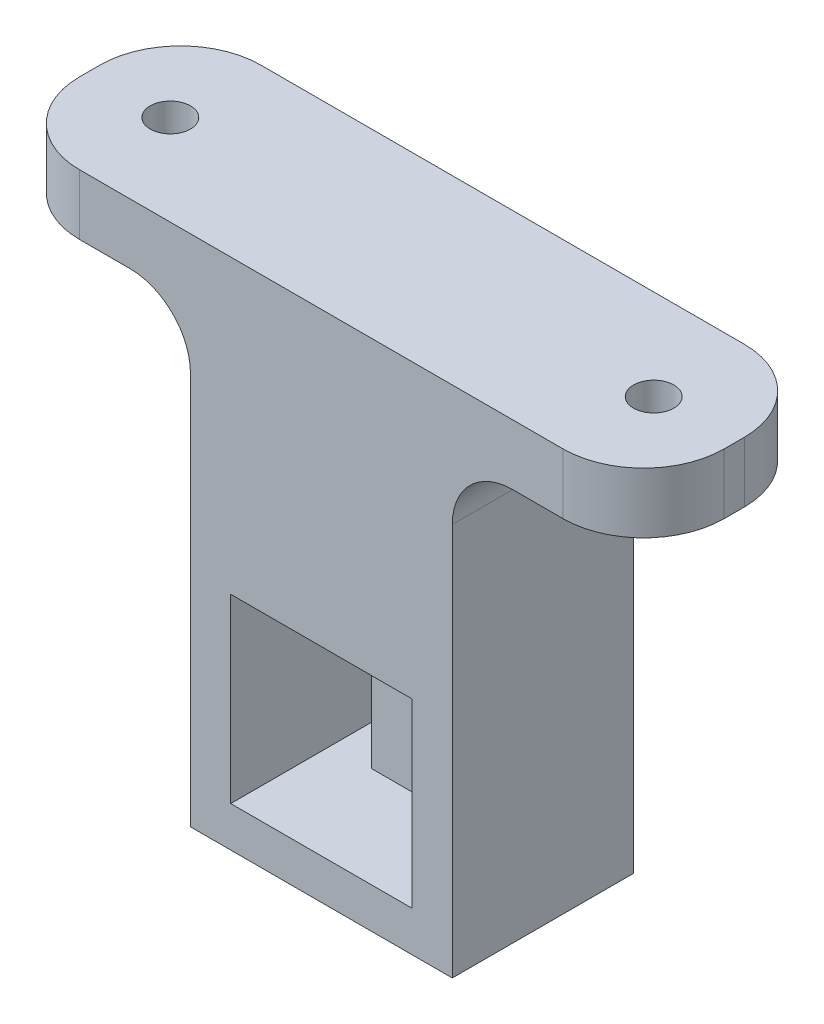
ISO-10303-21;
HEADER;
FILE_DESCRIPTION(('STEP AP214'),'2;1');
FILE_NAME('part.step','',(''),(''),'','','');
FILE_SCHEMA(('AUTOMOTIVE_DESIGN { 1 0 10303 214 1 1 1 1 }'));
ENDSEC;
DATA;
#1=APPLICATION_CONTEXT('core data for automotive mechanical design processes');
#2=APPLICATION_PROTOCOL_DEFINITION('international standard','automotive_design',2000,#1);
#3=PRODUCT_CONTEXT('',#1,'mechanical');
#4=PRODUCT('Part','Part','',(#3));
#5=PRODUCT_RELATED_PRODUCT_CATEGORY('part','',(#4));
#6=PRODUCT_DEFINITION_FORMATION('','',#4);
#7=PRODUCT_DEFINITION_CONTEXT('part definition',#1,'design');
#8=PRODUCT_DEFINITION('design','',#6,#7);
#9=PRODUCT_DEFINITION_SHAPE('','',#8);
#10=(LENGTH_UNIT() NAMED_UNIT(*) SI_UNIT(.MILLI.,.METRE.));
#11=(NAMED_UNIT(*) PLANE_ANGLE_UNIT() SI_UNIT($,.RADIAN.));
#12=(NAMED_UNIT(*) SI_UNIT($,.STERADIAN.) SOLID_ANGLE_UNIT());
#13=UNCERTAINTY_MEASURE_WITH_UNIT(LENGTH_MEASURE(1.E-05),#10,'distance_accuracy_value','');
#14=(GEOMETRIC_REPRESENTATION_CONTEXT(3) GLOBAL_UNCERTAINTY_ASSIGNED_CONTEXT((#13)) GLOBAL_UNIT_ASSIGNED_CONTEXT((#10,
#11,#12)) REPRESENTATION_CONTEXT('',''));
#15=CARTESIAN_POINT('',(0.,0.,0.));
#16=DIRECTION('',(0.,0.,1.));
#17=DIRECTION('',(1.,0.,0.));
#18=AXIS2_PLACEMENT_3D('',#15,#16,#17);
#19=CARTESIAN_POINT('',(-6.5,0.,-32.));
#20=DIRECTION('',(1.,0.,0.));
#21=DIRECTION('',(0.,1.,0.));
#22=AXIS2_PLACEMENT_3D('',#19,#20,#21);
#23=PLANE('',#22);
#24=DIRECTION('',(0.,-1.,0.));
#25=VECTOR('',#24,1.);
#26=CARTESIAN_POINT('',(-6.5,12.5,-23.));
#27=LINE('',#26,#25);
#28=CARTESIAN_POINT('',(-6.50000000000001,19.,-23.));
#29=VERTEX_POINT('',#28);
#30=CARTESIAN_POINT('',(-6.5,-0.499999999999999,-23.));
#31=VERTEX_POINT('',#30);
#32=EDGE_CURVE('E276',#29,#31,#27,.T.);
#33=ORIENTED_EDGE('',*,*,#32,.F.);
#34=DIRECTION('',(0.,0.,-1.));
#35=VECTOR('',#34,1.);
#36=CARTESIAN_POINT('',(-6.5,19.,-32.));
#37=LINE('',#36,#35);
#38=CARTESIAN_POINT('',(-6.5,19.,-32.));
#39=VERTEX_POINT('',#38);
#40=EDGE_CURVE('E345',#29,#39,#37,.T.);
#41=ORIENTED_EDGE('',*,*,#40,.T.);
#42=DIRECTION('',(0.,1.,0.));
#43=VECTOR('',#42,1.);
#44=CARTESIAN_POINT('',(-6.5,0.,-32.));
#45=LINE('',#44,#43);
#46=CARTESIAN_POINT('',(-6.5,-0.499999999999999,-32.));
#47=VERTEX_POINT('',#46);
#48=EDGE_CURVE('E311',#47,#39,#45,.T.);
#49=ORIENTED_EDGE('',*,*,#48,.F.);
#50=DIRECTION('',(0.,0.,1.));
#51=VECTOR('',#50,1.);
#52=CARTESIAN_POINT('',(-6.5,-0.499999999999999,-32.));
#53=LINE('',#52,#51);
#54=EDGE_CURVE('E321',#47,#31,#53,.T.);
#55=ORIENTED_EDGE('',*,*,#54,.T.);
#56=EDGE_LOOP('',(#33,#41,#49,#55));
#57=FACE_BOUND('',#56,.T.);
#58=ADVANCED_FACE('F33',(#57),#23,.F.);
#59=CARTESIAN_POINT('',(6.5,0.,-32.));
#60=DIRECTION('',(-1.,0.,0.));
#61=DIRECTION('',(0.,-1.,0.));
#62=AXIS2_PLACEMENT_3D('',#59,#60,#61);
#63=PLANE('',#62);
#64=DIRECTION('',(0.,-1.,0.));
#65=VECTOR('',#64,1.);
#66=CARTESIAN_POINT('',(6.5,0.,-32.));
#67=LINE('',#66,#65);
#68=CARTESIAN_POINT('',(6.5,19.,-32.));
#69=VERTEX_POINT('',#68);
#70=CARTESIAN_POINT('',(6.5,-0.499999999999999,-32.));
#71=VERTEX_POINT('',#70);
#72=EDGE_CURVE('E313',#69,#71,#67,.T.);
#73=ORIENTED_EDGE('',*,*,#72,.F.);
#74=DIRECTION('',(0.,0.,1.));
#75=VECTOR('',#74,1.);
#76=CARTESIAN_POINT('',(6.5,19.,-32.));
#77=LINE('',#76,#75);
#78=CARTESIAN_POINT('',(6.5,19.,-23.));
#79=VERTEX_POINT('',#78);
#80=EDGE_CURVE('E279',#69,#79,#77,.T.);
#81=ORIENTED_EDGE('',*,*,#80,.T.);
#82=DIRECTION('',(0.,1.,0.));
#83=VECTOR('',#82,1.);
#84=CARTESIAN_POINT('',(6.5,-0.499999999999999,-23.));
#85=LINE('',#84,#83);
#86=CARTESIAN_POINT('',(6.5,-0.499999999999999,-23.));
#87=VERTEX_POINT('',#86);
#88=EDGE_CURVE('E288',#87,#79,#85,.T.);
#89=ORIENTED_EDGE('',*,*,#88,.F.);
#90=DIRECTION('',(0.,0.,1.));
#91=VECTOR('',#90,1.);
#92=CARTESIAN_POINT('',(6.5,-0.499999999999999,-32.));
#93=LINE('',#92,#91);
#94=EDGE_CURVE('E283',#71,#87,#93,.T.);
#95=ORIENTED_EDGE('',*,*,#94,.F.);
#96=EDGE_LOOP('',(#73,#81,#89,#95));
#97=FACE_BOUND('',#96,.T.);
#98=ADVANCED_FACE('F357',(#97),#63,.F.);
#99=CARTESIAN_POINT('',(-2.5,0.,-32.));
#100=DIRECTION('',(1.,0.,0.));
#101=DIRECTION('',(0.,1.,0.));
#102=AXIS2_PLACEMENT_3D('',#99,#100,#101);
#103=PLANE('',#102);
#104=DIRECTION('',(0.,1.,0.));
#105=VECTOR('',#104,1.);
#106=CARTESIAN_POINT('',(-2.5,0.,-28.));
#107=LINE('',#106,#105);
#108=CARTESIAN_POINT('',(-2.5,1.5,-28.));
#109=VERTEX_POINT('',#108);
#110=CARTESIAN_POINT('',(-2.5,10.5,-28.));
#111=VERTEX_POINT('',#110);
#112=EDGE_CURVE('E296',#109,#111,#107,.T.);
#113=ORIENTED_EDGE('',*,*,#112,.T.);
#114=DIRECTION('',(0.,0.,1.));
#115=VECTOR('',#114,1.);
#116=CARTESIAN_POINT('',(-2.5,10.5,-32.));
#117=LINE('',#116,#115);
#118=CARTESIAN_POINT('',(-2.5,10.5,-32.));
#119=VERTEX_POINT('',#118);
#120=EDGE_CURVE('E324',#119,#111,#117,.T.);
#121=ORIENTED_EDGE('',*,*,#120,.F.);
#122=DIRECTION('',(0.,1.,0.));
#123=VECTOR('',#122,1.);
#124=CARTESIAN_POINT('',(-2.5,0.,-32.));
#125=LINE('',#124,#123);
#126=CARTESIAN_POINT('',(-2.5,1.5,-32.));
#127=VERTEX_POINT('',#126);
#128=EDGE_CURVE('E306',#127,#119,#125,.T.);
#129=ORIENTED_EDGE('',*,*,#128,.F.);
#130=DIRECTION('',(0.,0.,1.));
#131=VECTOR('',#130,1.);
#132=CARTESIAN_POINT('',(-2.5,1.5,-32.));
#133=LINE('',#132,#131);
#134=EDGE_CURVE('E326',#127,#109,#133,.T.);
#135=ORIENTED_EDGE('',*,*,#134,.T.);
#136=EDGE_LOOP('',(#113,#121,#129,#135));
#137=FACE_BOUND('',#136,.T.);
#138=ADVANCED_FACE('F411',(#137),#103,.F.);
#139=CARTESIAN_POINT('',(0.,10.5,-32.));
#140=DIRECTION('',(0.,-1.,0.));
#141=DIRECTION('',(0.,0.,-1.));
#142=AXIS2_PLACEMENT_3D('',#139,#140,#141);
#143=PLANE('',#142);
#144=ORIENTED_EDGE('',*,*,#120,.T.);
#145=DIRECTION('',(-1.,0.,0.));
#146=VECTOR('',#145,1.);
#147=CARTESIAN_POINT('',(4.5,10.5,-28.));
#148=LINE('',#147,#146);
#149=CARTESIAN_POINT('',(2.5,10.5,-28.));
#150=VERTEX_POINT('',#149);
#151=EDGE_CURVE('E277',#150,#111,#148,.T.);
#152=ORIENTED_EDGE('',*,*,#151,.F.);
#153=DIRECTION('',(0.,0.,1.));
#154=VECTOR('',#153,1.);
#155=CARTESIAN_POINT('',(2.5,10.5,-32.));
#156=LINE('',#155,#154);
#157=CARTESIAN_POINT('',(2.5,10.5,-32.));
#158=VERTEX_POINT('',#157);
#159=EDGE_CURVE('E329',#158,#150,#156,.T.);
#160=ORIENTED_EDGE('',*,*,#159,.F.);
#161=DIRECTION('',(1.,0.,0.));
#162=VECTOR('',#161,1.);
#163=CARTESIAN_POINT('',(0.,10.5,-32.));
#164=LINE('',#163,#162);
#165=CARTESIAN_POINT('',(4.5,10.5,-32.));
#166=VERTEX_POINT('',#165);
#167=EDGE_CURVE('E292',#158,#166,#164,.T.);
#168=ORIENTED_EDGE('',*,*,#167,.T.);
#169=DIRECTION('',(0.,0.,1.));
#170=VECTOR('',#169,1.);
#171=CARTESIAN_POINT('',(4.5,10.5,-32.));
#172=LINE('',#171,#170);
#173=CARTESIAN_POINT('',(4.5,10.5,-23.));
#174=VERTEX_POINT('',#173);
#175=EDGE_CURVE('E317',#166,#174,#172,.T.);
#176=ORIENTED_EDGE('',*,*,#175,.T.);
#177=DIRECTION('',(-1.,0.,0.));
#178=VECTOR('',#177,1.);
#179=CARTESIAN_POINT('',(4.5,10.5,-23.));
#180=LINE('',#179,#178);
#181=CARTESIAN_POINT('',(-4.5,10.5,-23.));
#182=VERTEX_POINT('',#181);
#183=EDGE_CURVE('E264',#174,#182,#180,.T.);
#184=ORIENTED_EDGE('',*,*,#183,.T.);
#185=DIRECTION('',(0.,0.,1.));
#186=VECTOR('',#185,1.);
#187=CARTESIAN_POINT('',(-4.5,10.5,-32.));
#188=LINE('',#187,#186);
#189=CARTESIAN_POINT('',(-4.5,10.5,-32.));
#190=VERTEX_POINT('',#189);
#191=EDGE_CURVE('E331',#190,#182,#188,.T.);
#192=ORIENTED_EDGE('',*,*,#191,.F.);
#193=EDGE_CURVE('E297',#190,#119,#164,.T.);
#194=ORIENTED_EDGE('',*,*,#193,.T.);
#195=EDGE_LOOP('',(#144,#152,#160,#168,#176,#184,#192,#194));
#196=FACE_BOUND('',#195,.T.);
#197=ADVANCED_FACE('F420',(#196),#143,.T.);
#198=CARTESIAN_POINT('',(-4.5,0.,-32.));
#199=DIRECTION('',(1.,0.,0.));
#200=DIRECTION('',(0.,1.,0.));
#201=AXIS2_PLACEMENT_3D('',#198,#199,#200);
#202=PLANE('',#201);
#203=ORIENTED_EDGE('',*,*,#191,.T.);
#204=DIRECTION('',(0.,-1.,0.));
#205=VECTOR('',#204,1.);
#206=CARTESIAN_POINT('',(-4.5,10.5,-23.));
#207=LINE('',#206,#205);
#208=CARTESIAN_POINT('',(-4.5,1.5,-23.));
#209=VERTEX_POINT('',#208);
#210=EDGE_CURVE('E267',#182,#209,#207,.T.);
#211=ORIENTED_EDGE('',*,*,#210,.T.);
#212=DIRECTION('',(0.,0.,1.));
#213=VECTOR('',#212,1.);
#214=CARTESIAN_POINT('',(-4.5,1.5,-32.));
#215=LINE('',#214,#213);
#216=CARTESIAN_POINT('',(-4.5,1.5,-32.));
#217=VERTEX_POINT('',#216);
#218=EDGE_CURVE('E328',#217,#209,#215,.T.);
#219=ORIENTED_EDGE('',*,*,#218,.F.);
#220=DIRECTION('',(0.,1.,0.));
#221=VECTOR('',#220,1.);
#222=CARTESIAN_POINT('',(-4.5,0.,-32.));
#223=LINE('',#222,#221);
#224=EDGE_CURVE('E308',#217,#190,#223,.T.);
#225=ORIENTED_EDGE('',*,*,#224,.T.);
#226=EDGE_LOOP('',(#203,#211,#219,#225));
#227=FACE_BOUND('',#226,.T.);
#228=ADVANCED_FACE('F417',(#227),#202,.T.);
#229=CARTESIAN_POINT('',(2.5,0.,-32.));
#230=DIRECTION('',(-1.,0.,0.));
#231=DIRECTION('',(0.,-1.,0.));
#232=AXIS2_PLACEMENT_3D('',#229,#230,#231);
#233=PLANE('',#232);
#234=DIRECTION('',(0.,-1.,0.));
#235=VECTOR('',#234,1.);
#236=CARTESIAN_POINT('',(2.5,0.,-28.));
#237=LINE('',#236,#235);
#238=CARTESIAN_POINT('',(2.5,1.5,-28.));
#239=VERTEX_POINT('',#238);
#240=EDGE_CURVE('E291',#150,#239,#237,.T.);
#241=ORIENTED_EDGE('',*,*,#240,.T.);
#242=DIRECTION('',(0.,0.,1.));
#243=VECTOR('',#242,1.);
#244=CARTESIAN_POINT('',(2.5,1.5,-32.));
#245=LINE('',#244,#243);
#246=CARTESIAN_POINT('',(2.5,1.5,-32.));
#247=VERTEX_POINT('',#246);
#248=EDGE_CURVE('E338',#247,#239,#245,.T.);
#249=ORIENTED_EDGE('',*,*,#248,.F.);
#250=DIRECTION('',(0.,-1.,0.));
#251=VECTOR('',#250,1.);
#252=CARTESIAN_POINT('',(2.5,0.,-32.));
#253=LINE('',#252,#251);
#254=EDGE_CURVE('E295',#158,#247,#253,.T.);
#255=ORIENTED_EDGE('',*,*,#254,.F.);
#256=ORIENTED_EDGE('',*,*,#159,.T.);
#257=EDGE_LOOP('',(#241,#249,#255,#256));
#258=FACE_BOUND('',#257,.T.);
#259=ADVANCED_FACE('F415',(#258),#233,.F.);
#260=CARTESIAN_POINT('',(0.,1.5,-32.));
#261=DIRECTION('',(0.,1.,0.));
#262=DIRECTION('',(0.,0.,1.));
#263=AXIS2_PLACEMENT_3D('',#260,#261,#262);
#264=PLANE('',#263);
#265=ORIENTED_EDGE('',*,*,#218,.T.);
#266=DIRECTION('',(1.,0.,0.));
#267=VECTOR('',#266,1.);
#268=CARTESIAN_POINT('',(-4.5,1.5,-23.));
#269=LINE('',#268,#267);
#270=CARTESIAN_POINT('',(4.5,1.5,-23.));
#271=VERTEX_POINT('',#270);
#272=EDGE_CURVE('E270',#209,#271,#269,.T.);
#273=ORIENTED_EDGE('',*,*,#272,.T.);
#274=DIRECTION('',(0.,0.,1.));
#275=VECTOR('',#274,1.);
#276=CARTESIAN_POINT('',(4.5,1.5,-32.));
#277=LINE('',#276,#275);
#278=CARTESIAN_POINT('',(4.5,1.5,-32.));
#279=VERTEX_POINT('',#278);
#280=EDGE_CURVE('E336',#279,#271,#277,.T.);
#281=ORIENTED_EDGE('',*,*,#280,.F.);
#282=DIRECTION('',(-1.,0.,0.));
#283=VECTOR('',#282,1.);
#284=CARTESIAN_POINT('',(0.,1.5,-32.));
#285=LINE('',#284,#283);
#286=EDGE_CURVE('E299',#279,#247,#285,.T.);
#287=ORIENTED_EDGE('',*,*,#286,.T.);
#288=ORIENTED_EDGE('',*,*,#248,.T.);
#289=DIRECTION('',(1.,0.,0.));
#290=VECTOR('',#289,1.);
#291=CARTESIAN_POINT('',(-4.5,1.5,-28.));
#292=LINE('',#291,#290);
#293=EDGE_CURVE('E280',#109,#239,#292,.T.);
#294=ORIENTED_EDGE('',*,*,#293,.F.);
#295=ORIENTED_EDGE('',*,*,#134,.F.);
#296=EDGE_CURVE('E303',#127,#217,#285,.T.);
#297=ORIENTED_EDGE('',*,*,#296,.T.);
#298=EDGE_LOOP('',(#265,#273,#281,#287,#288,#294,#295,#297));
#299=FACE_BOUND('',#298,.T.);
#300=ADVANCED_FACE('F401',(#299),#264,.T.);
#301=CARTESIAN_POINT('',(4.5,0.,-32.));
#302=DIRECTION('',(-1.,0.,0.));
#303=DIRECTION('',(0.,-1.,0.));
#304=AXIS2_PLACEMENT_3D('',#301,#302,#303);
#305=PLANE('',#304);
#306=ORIENTED_EDGE('',*,*,#280,.T.);
#307=DIRECTION('',(0.,1.,0.));
#308=VECTOR('',#307,1.);
#309=CARTESIAN_POINT('',(4.5,1.5,-23.));
#310=LINE('',#309,#308);
#311=EDGE_CURVE('E273',#271,#174,#310,.T.);
#312=ORIENTED_EDGE('',*,*,#311,.T.);
#313=ORIENTED_EDGE('',*,*,#175,.F.);
#314=DIRECTION('',(0.,-1.,0.));
#315=VECTOR('',#314,1.);
#316=CARTESIAN_POINT('',(4.5,0.,-32.));
#317=LINE('',#316,#315);
#318=EDGE_CURVE('E302',#166,#279,#317,.T.);
#319=ORIENTED_EDGE('',*,*,#318,.T.);
#320=EDGE_LOOP('',(#306,#312,#313,#319));
#321=FACE_BOUND('',#320,.T.);
#322=ADVANCED_FACE('F393',(#321),#305,.T.);
#323=CARTESIAN_POINT('',(0.,-0.499999999999999,-32.));
#324=DIRECTION('',(0.,1.,0.));
#325=DIRECTION('',(0.,0.,1.));
#326=AXIS2_PLACEMENT_3D('',#323,#324,#325);
#327=PLANE('',#326);
#328=ORIENTED_EDGE('',*,*,#94,.T.);
#329=DIRECTION('',(1.,0.,0.));
#330=VECTOR('',#329,1.);
#331=CARTESIAN_POINT('',(-6.5,-0.499999999999999,-23.));
#332=LINE('',#331,#330);
#333=EDGE_CURVE('E285',#31,#87,#332,.T.);
#334=ORIENTED_EDGE('',*,*,#333,.F.);
#335=ORIENTED_EDGE('',*,*,#54,.F.);
#336=DIRECTION('',(-1.,0.,0.));
#337=VECTOR('',#336,1.);
#338=CARTESIAN_POINT('',(0.,-0.499999999999999,-32.));
#339=LINE('',#338,#337);
#340=EDGE_CURVE('E315',#71,#47,#339,.T.);
#341=ORIENTED_EDGE('',*,*,#340,.F.);
#342=EDGE_LOOP('',(#328,#334,#335,#341));
#343=FACE_BOUND('',#342,.T.);
#344=ADVANCED_FACE('F391',(#343),#327,.F.);
#345=CARTESIAN_POINT('',(0.,0.,-32.));
#346=DIRECTION('',(0.,0.,-1.));
#347=DIRECTION('',(-1.,0.,0.));
#348=AXIS2_PLACEMENT_3D('',#345,#346,#347);
#349=PLANE('',#348);
#350=ORIENTED_EDGE('',*,*,#48,.T.);
#351=CARTESIAN_POINT('',(-9.50000000000001,19.,-32.));
#352=DIRECTION('',(0.,0.,-1.));
#353=DIRECTION('',(-1.,0.,0.));
#354=AXIS2_PLACEMENT_3D('',#351,#352,#353);
#355=CIRCLE('',#354,3.);
#356=CARTESIAN_POINT('',(-9.50000000000001,22.,-32.));
#357=VERTEX_POINT('',#356);
#358=EDGE_CURVE('E41',#39,#357,#355,.F.);
#359=ORIENTED_EDGE('',*,*,#358,.T.);
#360=DIRECTION('',(-1.,0.,0.));
#361=VECTOR('',#360,1.);
#362=CARTESIAN_POINT('',(-12.,22.,-32.));
#363=LINE('',#362,#361);
#364=CARTESIAN_POINT('',(-12.,22.,-32.));
#365=VERTEX_POINT('',#364);
#366=EDGE_CURVE('E205',#357,#365,#363,.T.);
#367=ORIENTED_EDGE('',*,*,#366,.T.);
#368=DIRECTION('',(0.,1.,0.));
#369=VECTOR('',#368,1.);
#370=CARTESIAN_POINT('',(-12.,22.,-32.));
#371=LINE('',#370,#369);
#372=CARTESIAN_POINT('',(-12.,25.,-32.));
#373=VERTEX_POINT('',#372);
#374=EDGE_CURVE('E192',#365,#373,#371,.T.);
#375=ORIENTED_EDGE('',*,*,#374,.T.);
#376=DIRECTION('',(1.,0.,0.));
#377=VECTOR('',#376,1.);
#378=CARTESIAN_POINT('',(6.5,25.,-32.));
#379=LINE('',#378,#377);
#380=CARTESIAN_POINT('',(12.,25.,-32.));
#381=VERTEX_POINT('',#380);
#382=EDGE_CURVE('E187',#373,#381,#379,.T.);
#383=ORIENTED_EDGE('',*,*,#382,.T.);
#384=DIRECTION('',(0.,1.,0.));
#385=VECTOR('',#384,1.);
#386=CARTESIAN_POINT('',(12.,22.,-32.));
#387=LINE('',#386,#385);
#388=CARTESIAN_POINT('',(12.,22.,-32.));
#389=VERTEX_POINT('',#388);
#390=EDGE_CURVE('E180',#389,#381,#387,.T.);
#391=ORIENTED_EDGE('',*,*,#390,.F.);
#392=CARTESIAN_POINT('',(9.5,22.,-32.));
#393=VERTEX_POINT('',#392);
#394=EDGE_CURVE('E184',#389,#393,#363,.T.);
#395=ORIENTED_EDGE('',*,*,#394,.T.);
#396=CARTESIAN_POINT('',(9.5,19.,-32.));
#397=DIRECTION('',(0.,0.,-1.));
#398=DIRECTION('',(-1.,0.,0.));
#399=AXIS2_PLACEMENT_3D('',#396,#397,#398);
#400=CIRCLE('',#399,3.);
#401=EDGE_CURVE('E351',#393,#69,#400,.F.);
#402=ORIENTED_EDGE('',*,*,#401,.T.);
#403=ORIENTED_EDGE('',*,*,#72,.T.);
#404=ORIENTED_EDGE('',*,*,#340,.T.);
#405=EDGE_LOOP('',(#350,#359,#367,#375,#383,#391,#395,#402,#403,#404));
#406=FACE_BOUND('',#405,.T.);
#407=ORIENTED_EDGE('',*,*,#167,.F.);
#408=ORIENTED_EDGE('',*,*,#254,.T.);
#409=ORIENTED_EDGE('',*,*,#286,.F.);
#410=ORIENTED_EDGE('',*,*,#318,.F.);
#411=EDGE_LOOP('',(#407,#408,#409,#410));
#412=FACE_BOUND('',#411,.T.);
#413=ORIENTED_EDGE('',*,*,#128,.T.);
#414=ORIENTED_EDGE('',*,*,#193,.F.);
#415=ORIENTED_EDGE('',*,*,#224,.F.);
#416=ORIENTED_EDGE('',*,*,#296,.F.);
#417=EDGE_LOOP('',(#413,#414,#415,#416));
#418=FACE_BOUND('',#417,.T.);
#419=ADVANCED_FACE('F182',(#406,#412,#418),#349,.T.);
#420=CARTESIAN_POINT('',(0.,0.,-28.));
#421=DIRECTION('',(0.,0.,-1.));
#422=DIRECTION('',(-1.,0.,0.));
#423=AXIS2_PLACEMENT_3D('',#420,#421,#422);
#424=PLANE('',#423);
#425=ORIENTED_EDGE('',*,*,#240,.F.);
#426=ORIENTED_EDGE('',*,*,#151,.T.);
#427=ORIENTED_EDGE('',*,*,#112,.F.);
#428=ORIENTED_EDGE('',*,*,#293,.T.);
#429=EDGE_LOOP('',(#425,#426,#427,#428));
#430=FACE_BOUND('',#429,.T.);
#431=ADVANCED_FACE('F399',(#430),#424,.F.);
#432=CARTESIAN_POINT('',(0.,0.,-23.));
#433=DIRECTION('',(0.,0.,1.));
#434=DIRECTION('',(1.,0.,0.));
#435=AXIS2_PLACEMENT_3D('',#432,#433,#434);
#436=PLANE('',#435);
#437=ORIENTED_EDGE('',*,*,#88,.T.);
#438=CARTESIAN_POINT('',(9.5,19.,-23.));
#439=DIRECTION('',(0.,0.,1.));
#440=DIRECTION('',(1.,0.,0.));
#441=AXIS2_PLACEMENT_3D('',#438,#439,#440);
#442=CIRCLE('',#441,3.);
#443=CARTESIAN_POINT('',(9.5,22.,-23.));
#444=VERTEX_POINT('',#443);
#445=EDGE_CURVE('E349',#79,#444,#442,.F.);
#446=ORIENTED_EDGE('',*,*,#445,.T.);
#447=DIRECTION('',(1.,0.,0.));
#448=VECTOR('',#447,1.);
#449=CARTESIAN_POINT('',(-12.,22.,-23.));
#450=LINE('',#449,#448);
#451=CARTESIAN_POINT('',(12.,22.,-23.));
#452=VERTEX_POINT('',#451);
#453=EDGE_CURVE('E226',#444,#452,#450,.T.);
#454=ORIENTED_EDGE('',*,*,#453,.T.);
#455=DIRECTION('',(0.,1.,0.));
#456=VECTOR('',#455,1.);
#457=CARTESIAN_POINT('',(12.,22.,-23.));
#458=LINE('',#457,#456);
#459=CARTESIAN_POINT('',(12.,25.,-23.));
#460=VERTEX_POINT('',#459);
#461=EDGE_CURVE('E251',#452,#460,#458,.T.);
#462=ORIENTED_EDGE('',*,*,#461,.T.);
#463=DIRECTION('',(-1.,0.,0.));
#464=VECTOR('',#463,1.);
#465=CARTESIAN_POINT('',(-6.5,25.,-23.));
#466=LINE('',#465,#464);
#467=CARTESIAN_POINT('',(-12.,25.,-23.));
#468=VERTEX_POINT('',#467);
#469=EDGE_CURVE('E248',#460,#468,#466,.T.);
#470=ORIENTED_EDGE('',*,*,#469,.T.);
#471=DIRECTION('',(0.,1.,0.));
#472=VECTOR('',#471,1.);
#473=CARTESIAN_POINT('',(-12.,22.,-23.));
#474=LINE('',#473,#472);
#475=CARTESIAN_POINT('',(-12.,22.,-23.));
#476=VERTEX_POINT('',#475);
#477=EDGE_CURVE('E254',#476,#468,#474,.T.);
#478=ORIENTED_EDGE('',*,*,#477,.F.);
#479=CARTESIAN_POINT('',(-9.50000000000001,22.,-23.));
#480=VERTEX_POINT('',#479);
#481=EDGE_CURVE('E227',#476,#480,#450,.T.);
#482=ORIENTED_EDGE('',*,*,#481,.T.);
#483=CARTESIAN_POINT('',(-9.50000000000001,19.,-23.));
#484=DIRECTION('',(0.,0.,1.));
#485=DIRECTION('',(1.,0.,0.));
#486=AXIS2_PLACEMENT_3D('',#483,#484,#485);
#487=CIRCLE('',#486,3.);
#488=EDGE_CURVE('E11',#480,#29,#487,.F.);
#489=ORIENTED_EDGE('',*,*,#488,.T.);
#490=ORIENTED_EDGE('',*,*,#32,.T.);
#491=ORIENTED_EDGE('',*,*,#333,.T.);
#492=EDGE_LOOP('',(#437,#446,#454,#462,#470,#478,#482,#489,#490,#491));
#493=FACE_BOUND('',#492,.T.);
#494=ORIENTED_EDGE('',*,*,#210,.F.);
#495=ORIENTED_EDGE('',*,*,#183,.F.);
#496=ORIENTED_EDGE('',*,*,#311,.F.);
#497=ORIENTED_EDGE('',*,*,#272,.F.);
#498=EDGE_LOOP('',(#494,#495,#496,#497));
#499=FACE_BOUND('',#498,.T.);
#500=ADVANCED_FACE('F362',(#493,#499),#436,.T.);
#501=CARTESIAN_POINT('',(0.,25.,0.));
#502=DIRECTION('',(0.,-1.,0.));
#503=DIRECTION('',(1.,0.,0.));
#504=AXIS2_PLACEMENT_3D('',#501,#502,#503);
#505=PLANE('',#504);
#506=CARTESIAN_POINT('',(-12.,25.,-27.5));
#507=DIRECTION('',(0.,-1.,0.));
#508=DIRECTION('',(1.,0.,0.));
#509=AXIS2_PLACEMENT_3D('',#506,#507,#508);
#510=CIRCLE('',#509,1.);
#511=CARTESIAN_POINT('',(-11.,25.,-27.5));
#512=VERTEX_POINT('',#511);
#513=EDGE_CURVE('E236',#512,#512,#510,.T.);
#514=ORIENTED_EDGE('',*,*,#513,.T.);
#515=EDGE_LOOP('',(#514));
#516=FACE_BOUND('',#515,.T.);
#517=CARTESIAN_POINT('',(12.,25.,-27.5));
#518=DIRECTION('',(0.,-1.,0.));
#519=DIRECTION('',(1.,0.,0.));
#520=AXIS2_PLACEMENT_3D('',#517,#518,#519);
#521=CIRCLE('',#520,1.);
#522=CARTESIAN_POINT('',(13.,25.,-27.5));
#523=VERTEX_POINT('',#522);
#524=EDGE_CURVE('E722',#523,#523,#521,.T.);
#525=ORIENTED_EDGE('',*,*,#524,.T.);
#526=EDGE_LOOP('',(#525));
#527=FACE_BOUND('',#526,.T.);
#528=ORIENTED_EDGE('',*,*,#469,.F.);
#529=CARTESIAN_POINT('',(12.,25.,-27.));
#530=DIRECTION('',(0.,1.,0.));
#531=DIRECTION('',(-1.,0.,0.));
#532=AXIS2_PLACEMENT_3D('',#529,#530,#531);
#533=CIRCLE('',#532,4.);
#534=CARTESIAN_POINT('',(16.,25.,-27.));
#535=VERTEX_POINT('',#534);
#536=EDGE_CURVE('E212',#460,#535,#533,.T.);
#537=ORIENTED_EDGE('',*,*,#536,.T.);
#538=DIRECTION('',(0.,0.,-1.));
#539=VECTOR('',#538,1.);
#540=CARTESIAN_POINT('',(16.,25.,-27.));
#541=LINE('',#540,#539);
#542=CARTESIAN_POINT('',(16.,25.,-28.));
#543=VERTEX_POINT('',#542);
#544=EDGE_CURVE('E209',#535,#543,#541,.T.);
#545=ORIENTED_EDGE('',*,*,#544,.T.);
#546=CARTESIAN_POINT('',(12.,25.,-28.));
#547=DIRECTION('',(0.,1.,0.));
#548=DIRECTION('',(1.,0.,0.));
#549=AXIS2_PLACEMENT_3D('',#546,#547,#548);
#550=CIRCLE('',#549,4.);
#551=EDGE_CURVE('E233',#543,#381,#550,.T.);
#552=ORIENTED_EDGE('',*,*,#551,.T.);
#553=ORIENTED_EDGE('',*,*,#382,.F.);
#554=CARTESIAN_POINT('',(-12.,25.,-28.));
#555=DIRECTION('',(0.,1.,0.));
#556=DIRECTION('',(1.,0.,0.));
#557=AXIS2_PLACEMENT_3D('',#554,#555,#556);
#558=CIRCLE('',#557,4.);
#559=CARTESIAN_POINT('',(-16.,25.,-28.));
#560=VERTEX_POINT('',#559);
#561=EDGE_CURVE('E235',#373,#560,#558,.T.);
#562=ORIENTED_EDGE('',*,*,#561,.T.);
#563=DIRECTION('',(0.,0.,1.));
#564=VECTOR('',#563,1.);
#565=CARTESIAN_POINT('',(-16.,25.,-27.));
#566=LINE('',#565,#564);
#567=CARTESIAN_POINT('',(-16.,25.,-27.));
#568=VERTEX_POINT('',#567);
#569=EDGE_CURVE('E239',#560,#568,#566,.T.);
#570=ORIENTED_EDGE('',*,*,#569,.T.);
#571=CARTESIAN_POINT('',(-12.,25.,-27.));
#572=DIRECTION('',(0.,1.,0.));
#573=DIRECTION('',(1.,0.,0.));
#574=AXIS2_PLACEMENT_3D('',#571,#572,#573);
#575=CIRCLE('',#574,4.);
#576=EDGE_CURVE('E242',#568,#468,#575,.T.);
#577=ORIENTED_EDGE('',*,*,#576,.T.);
#578=EDGE_LOOP('',(#528,#537,#545,#552,#553,#562,#570,#577));
#579=FACE_BOUND('',#578,.T.);
#580=ADVANCED_FACE('F374',(#516,#527,#579),#505,.F.);
#581=CARTESIAN_POINT('',(12.,22.,-28.));
#582=DIRECTION('',(0.,1.,0.));
#583=DIRECTION('',(-1.,0.,0.));
#584=AXIS2_PLACEMENT_3D('',#581,#582,#583);
#585=CYLINDRICAL_SURFACE('',#584,4.);
#586=ORIENTED_EDGE('',*,*,#551,.F.);
#587=DIRECTION('',(0.,1.,0.));
#588=VECTOR('',#587,1.);
#589=CARTESIAN_POINT('',(16.,22.,-28.));
#590=LINE('',#589,#588);
#591=CARTESIAN_POINT('',(16.,22.,-28.));
#592=VERTEX_POINT('',#591);
#593=EDGE_CURVE('E208',#592,#543,#590,.T.);
#594=ORIENTED_EDGE('',*,*,#593,.F.);
#595=CARTESIAN_POINT('',(12.,22.,-28.));
#596=DIRECTION('',(0.,1.,0.));
#597=DIRECTION('',(1.,0.,0.));
#598=AXIS2_PLACEMENT_3D('',#595,#596,#597);
#599=CIRCLE('',#598,4.);
#600=EDGE_CURVE('E200',#592,#389,#599,.T.);
#601=ORIENTED_EDGE('',*,*,#600,.T.);
#602=ORIENTED_EDGE('',*,*,#390,.T.);
#603=EDGE_LOOP('',(#586,#594,#601,#602));
#604=FACE_BOUND('',#603,.T.);
#605=ADVANCED_FACE('F207',(#604),#585,.T.);
#606=CARTESIAN_POINT('',(16.,22.,-27.));
#607=DIRECTION('',(1.,0.,0.));
#608=DIRECTION('',(0.,1.,0.));
#609=AXIS2_PLACEMENT_3D('',#606,#607,#608);
#610=PLANE('',#609);
#611=ORIENTED_EDGE('',*,*,#544,.F.);
#612=DIRECTION('',(0.,1.,0.));
#613=VECTOR('',#612,1.);
#614=CARTESIAN_POINT('',(16.,22.,-27.));
#615=LINE('',#614,#613);
#616=CARTESIAN_POINT('',(16.,22.,-27.));
#617=VERTEX_POINT('',#616);
#618=EDGE_CURVE('E249',#617,#535,#615,.T.);
#619=ORIENTED_EDGE('',*,*,#618,.F.);
#620=DIRECTION('',(0.,0.,-1.));
#621=VECTOR('',#620,1.);
#622=CARTESIAN_POINT('',(16.,22.,-27.));
#623=LINE('',#622,#621);
#624=EDGE_CURVE('E193',#617,#592,#623,.T.);
#625=ORIENTED_EDGE('',*,*,#624,.T.);
#626=ORIENTED_EDGE('',*,*,#593,.T.);
#627=EDGE_LOOP('',(#611,#619,#625,#626));
#628=FACE_BOUND('',#627,.T.);
#629=ADVANCED_FACE('F447',(#628),#610,.T.);
#630=CARTESIAN_POINT('',(12.,22.,-27.));
#631=DIRECTION('',(0.,1.,0.));
#632=DIRECTION('',(-1.,0.,0.));
#633=AXIS2_PLACEMENT_3D('',#630,#631,#632);
#634=CYLINDRICAL_SURFACE('',#633,4.);
#635=ORIENTED_EDGE('',*,*,#536,.F.);
#636=ORIENTED_EDGE('',*,*,#461,.F.);
#637=CARTESIAN_POINT('',(12.,22.,-27.));
#638=DIRECTION('',(0.,1.,0.));
#639=DIRECTION('',(-1.,0.,0.));
#640=AXIS2_PLACEMENT_3D('',#637,#638,#639);
#641=CIRCLE('',#640,4.);
#642=EDGE_CURVE('E229',#452,#617,#641,.T.);
#643=ORIENTED_EDGE('',*,*,#642,.T.);
#644=ORIENTED_EDGE('',*,*,#618,.T.);
#645=EDGE_LOOP('',(#635,#636,#643,#644));
#646=FACE_BOUND('',#645,.T.);
#647=ADVANCED_FACE('F368',(#646),#634,.T.);
#648=CARTESIAN_POINT('',(12.,22.,-28.));
#649=DIRECTION('',(0.,-1.,0.));
#650=DIRECTION('',(1.,0.,0.));
#651=AXIS2_PLACEMENT_3D('',#648,#649,#650);
#652=PLANE('',#651);
#653=CARTESIAN_POINT('',(12.,22.,-27.5));
#654=DIRECTION('',(0.,-1.,0.));
#655=DIRECTION('',(1.,0.,0.));
#656=AXIS2_PLACEMENT_3D('',#653,#654,#655);
#657=CIRCLE('',#656,1.);
#658=CARTESIAN_POINT('',(13.,22.,-27.5));
#659=VERTEX_POINT('',#658);
#660=EDGE_CURVE('E215',#659,#659,#657,.T.);
#661=ORIENTED_EDGE('',*,*,#660,.F.);
#662=EDGE_LOOP('',(#661));
#663=FACE_BOUND('',#662,.T.);
#664=ORIENTED_EDGE('',*,*,#453,.F.);
#665=DIRECTION('',(0.,0.,1.));
#666=VECTOR('',#665,1.);
#667=CARTESIAN_POINT('',(9.5,22.,-28.));
#668=LINE('',#667,#666);
#669=EDGE_CURVE('E203',#444,#393,#668,.F.);
#670=ORIENTED_EDGE('',*,*,#669,.T.);
#671=ORIENTED_EDGE('',*,*,#394,.F.);
#672=ORIENTED_EDGE('',*,*,#600,.F.);
#673=ORIENTED_EDGE('',*,*,#624,.F.);
#674=ORIENTED_EDGE('',*,*,#642,.F.);
#675=EDGE_LOOP('',(#664,#670,#671,#672,#673,#674));
#676=FACE_BOUND('',#675,.T.);
#677=ADVANCED_FACE('F198',(#663,#676),#652,.T.);
#678=CARTESIAN_POINT('',(-12.,22.,-27.5));
#679=DIRECTION('',(0.,-1.,0.));
#680=DIRECTION('',(1.,0.,0.));
#681=AXIS2_PLACEMENT_3D('',#678,#679,#680);
#682=CIRCLE('',#681,1.);
#683=CARTESIAN_POINT('',(-11.,22.,-27.5));
#684=VERTEX_POINT('',#683);
#685=EDGE_CURVE('E725',#684,#684,#682,.T.);
#686=ORIENTED_EDGE('',*,*,#685,.F.);
#687=EDGE_LOOP('',(#686));
#688=FACE_BOUND('',#687,.T.);
#689=ORIENTED_EDGE('',*,*,#366,.F.);
#690=DIRECTION('',(0.,0.,-1.));
#691=VECTOR('',#690,1.);
#692=CARTESIAN_POINT('',(-9.50000000000001,22.,-28.));
#693=LINE('',#692,#691);
#694=EDGE_CURVE('E54',#357,#480,#693,.F.);
#695=ORIENTED_EDGE('',*,*,#694,.T.);
#696=ORIENTED_EDGE('',*,*,#481,.F.);
#697=CARTESIAN_POINT('',(-12.,22.,-27.));
#698=DIRECTION('',(0.,1.,0.));
#699=DIRECTION('',(1.,0.,0.));
#700=AXIS2_PLACEMENT_3D('',#697,#698,#699);
#701=CIRCLE('',#700,4.);
#702=CARTESIAN_POINT('',(-16.,22.,-27.));
#703=VERTEX_POINT('',#702);
#704=EDGE_CURVE('E223',#703,#476,#701,.T.);
#705=ORIENTED_EDGE('',*,*,#704,.F.);
#706=DIRECTION('',(0.,0.,1.));
#707=VECTOR('',#706,1.);
#708=CARTESIAN_POINT('',(-16.,22.,-27.));
#709=LINE('',#708,#707);
#710=CARTESIAN_POINT('',(-16.,22.,-28.));
#711=VERTEX_POINT('',#710);
#712=EDGE_CURVE('E220',#711,#703,#709,.T.);
#713=ORIENTED_EDGE('',*,*,#712,.F.);
#714=CARTESIAN_POINT('',(-12.,22.,-28.));
#715=DIRECTION('',(0.,1.,0.));
#716=DIRECTION('',(1.,0.,0.));
#717=AXIS2_PLACEMENT_3D('',#714,#715,#716);
#718=CIRCLE('',#717,4.);
#719=EDGE_CURVE('E204',#365,#711,#718,.T.);
#720=ORIENTED_EDGE('',*,*,#719,.F.);
#721=EDGE_LOOP('',(#689,#695,#696,#705,#713,#720));
#722=FACE_BOUND('',#721,.T.);
#723=ADVANCED_FACE('F380',(#688,#722),#652,.T.);
#724=CARTESIAN_POINT('',(-12.,22.,-27.));
#725=DIRECTION('',(0.,1.,0.));
#726=DIRECTION('',(-1.,0.,0.));
#727=AXIS2_PLACEMENT_3D('',#724,#725,#726);
#728=CYLINDRICAL_SURFACE('',#727,4.);
#729=ORIENTED_EDGE('',*,*,#576,.F.);
#730=DIRECTION('',(0.,1.,0.));
#731=VECTOR('',#730,1.);
#732=CARTESIAN_POINT('',(-16.,22.,-27.));
#733=LINE('',#732,#731);
#734=EDGE_CURVE('E257',#703,#568,#733,.T.);
#735=ORIENTED_EDGE('',*,*,#734,.F.);
#736=ORIENTED_EDGE('',*,*,#704,.T.);
#737=ORIENTED_EDGE('',*,*,#477,.T.);
#738=EDGE_LOOP('',(#729,#735,#736,#737));
#739=FACE_BOUND('',#738,.T.);
#740=ADVANCED_FACE('F372',(#739),#728,.T.);
#741=CARTESIAN_POINT('',(-16.,22.,-27.));
#742=DIRECTION('',(-1.,0.,0.));
#743=DIRECTION('',(0.,-1.,0.));
#744=AXIS2_PLACEMENT_3D('',#741,#742,#743);
#745=PLANE('',#744);
#746=ORIENTED_EDGE('',*,*,#569,.F.);
#747=DIRECTION('',(0.,1.,0.));
#748=VECTOR('',#747,1.);
#749=CARTESIAN_POINT('',(-16.,22.,-28.));
#750=LINE('',#749,#748);
#751=EDGE_CURVE('E259',#711,#560,#750,.T.);
#752=ORIENTED_EDGE('',*,*,#751,.F.);
#753=ORIENTED_EDGE('',*,*,#712,.T.);
#754=ORIENTED_EDGE('',*,*,#734,.T.);
#755=EDGE_LOOP('',(#746,#752,#753,#754));
#756=FACE_BOUND('',#755,.T.);
#757=ADVANCED_FACE('F378',(#756),#745,.T.);
#758=CARTESIAN_POINT('',(-12.,22.,-28.));
#759=DIRECTION('',(0.,1.,0.));
#760=DIRECTION('',(-1.,0.,0.));
#761=AXIS2_PLACEMENT_3D('',#758,#759,#760);
#762=CYLINDRICAL_SURFACE('',#761,4.);
#763=ORIENTED_EDGE('',*,*,#561,.F.);
#764=ORIENTED_EDGE('',*,*,#374,.F.);
#765=ORIENTED_EDGE('',*,*,#719,.T.);
#766=ORIENTED_EDGE('',*,*,#751,.T.);
#767=EDGE_LOOP('',(#763,#764,#765,#766));
#768=FACE_BOUND('',#767,.T.);
#769=ADVANCED_FACE('F431',(#768),#762,.T.);
#770=CARTESIAN_POINT('',(9.5,19.,-32.));
#771=DIRECTION('',(0.,0.,1.));
#772=DIRECTION('',(1.,0.,0.));
#773=AXIS2_PLACEMENT_3D('',#770,#771,#772);
#774=CYLINDRICAL_SURFACE('',#773,3.);
#775=ORIENTED_EDGE('',*,*,#401,.F.);
#776=ORIENTED_EDGE('',*,*,#669,.F.);
#777=ORIENTED_EDGE('',*,*,#445,.F.);
#778=ORIENTED_EDGE('',*,*,#80,.F.);
#779=EDGE_LOOP('',(#775,#776,#777,#778));
#780=FACE_BOUND('',#779,.T.);
#781=ADVANCED_FACE('F360',(#780),#774,.F.);
#782=CARTESIAN_POINT('',(-9.50000000000001,19.,-32.));
#783=DIRECTION('',(0.,0.,-1.));
#784=DIRECTION('',(-1.,0.,0.));
#785=AXIS2_PLACEMENT_3D('',#782,#783,#784);
#786=CYLINDRICAL_SURFACE('',#785,3.);
#787=ORIENTED_EDGE('',*,*,#488,.F.);
#788=ORIENTED_EDGE('',*,*,#694,.F.);
#789=ORIENTED_EDGE('',*,*,#358,.F.);
#790=ORIENTED_EDGE('',*,*,#40,.F.);
#791=EDGE_LOOP('',(#787,#788,#789,#790));
#792=FACE_BOUND('',#791,.T.);
#793=ADVANCED_FACE('F35',(#792),#786,.F.);
#794=CARTESIAN_POINT('',(-12.,25.,-27.5));
#795=DIRECTION('',(0.,-1.,0.));
#796=DIRECTION('',(1.,0.,0.));
#797=AXIS2_PLACEMENT_3D('',#794,#795,#796);
#798=CYLINDRICAL_SURFACE('',#797,1.);
#799=ORIENTED_EDGE('',*,*,#513,.F.);
#800=EDGE_LOOP('',(#799));
#801=FACE_BOUND('',#800,.T.);
#802=ORIENTED_EDGE('',*,*,#685,.T.);
#803=EDGE_LOOP('',(#802));
#804=FACE_BOUND('',#803,.T.);
#805=ADVANCED_FACE('F436',(#801,#804),#798,.F.);
#806=CARTESIAN_POINT('',(12.,25.,-27.5));
#807=DIRECTION('',(0.,-1.,0.));
#808=DIRECTION('',(1.,0.,0.));
#809=AXIS2_PLACEMENT_3D('',#806,#807,#808);
#810=CYLINDRICAL_SURFACE('',#809,1.);
#811=ORIENTED_EDGE('',*,*,#524,.F.);
#812=EDGE_LOOP('',(#811));
#813=FACE_BOUND('',#812,.T.);
#814=ORIENTED_EDGE('',*,*,#660,.T.);
#815=EDGE_LOOP('',(#814));
#816=FACE_BOUND('',#815,.T.);
#817=ADVANCED_FACE('F705',(#813,#816),#810,.F.);
#818=CLOSED_SHELL('',(#58,#98,#138,#197,#228,#259,#300,#322,#344,#419,#431,#500,#580,#605,#629,
#647,#677,#723,#740,#757,#769,#781,#793,#805,#817));
#819=MANIFOLD_SOLID_BREP('B2',#818);
#820=ADVANCED_BREP_SHAPE_REPRESENTATION('',(#18,#819),#14);
#821=SHAPE_DEFINITION_REPRESENTATION(#9,#820);
ENDSEC;
END-ISO-10303-21;
